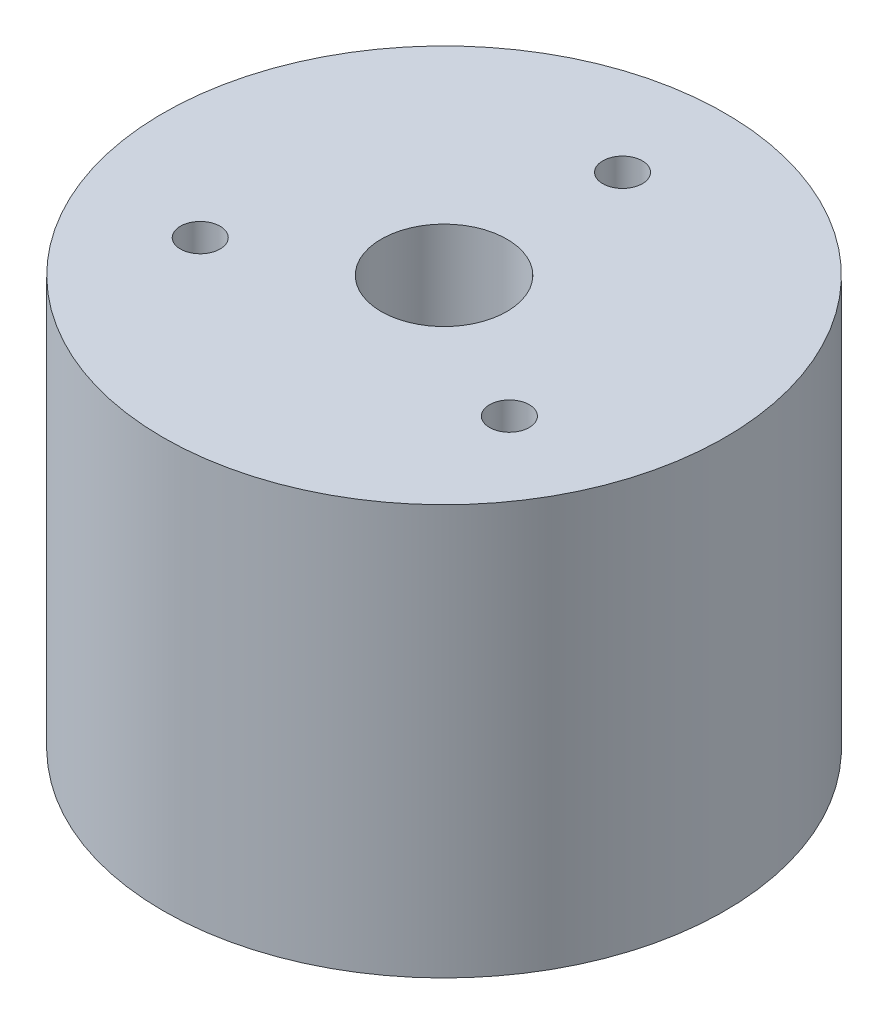
ISO-10303-21;
HEADER;
FILE_DESCRIPTION(('STEP AP214'),'2;1');
FILE_NAME('part.step','',(''),(''),'','','');
FILE_SCHEMA(('AUTOMOTIVE_DESIGN { 1 0 10303 214 1 1 1 1 }'));
ENDSEC;
DATA;
#1=APPLICATION_CONTEXT('core data for automotive mechanical design processes');
#2=APPLICATION_PROTOCOL_DEFINITION('international standard','automotive_design',2000,#1);
#3=PRODUCT_CONTEXT('',#1,'mechanical');
#4=PRODUCT('Part','Part','',(#3));
#5=PRODUCT_RELATED_PRODUCT_CATEGORY('part','',(#4));
#6=PRODUCT_DEFINITION_FORMATION('','',#4);
#7=PRODUCT_DEFINITION_CONTEXT('part definition',#1,'design');
#8=PRODUCT_DEFINITION('design','',#6,#7);
#9=PRODUCT_DEFINITION_SHAPE('','',#8);
#10=(LENGTH_UNIT() NAMED_UNIT(*) SI_UNIT(.MILLI.,.METRE.));
#11=(NAMED_UNIT(*) PLANE_ANGLE_UNIT() SI_UNIT($,.RADIAN.));
#12=(NAMED_UNIT(*) SI_UNIT($,.STERADIAN.) SOLID_ANGLE_UNIT());
#13=UNCERTAINTY_MEASURE_WITH_UNIT(LENGTH_MEASURE(1.E-05),#10,'distance_accuracy_value','');
#14=(GEOMETRIC_REPRESENTATION_CONTEXT(3) GLOBAL_UNCERTAINTY_ASSIGNED_CONTEXT((#13)) GLOBAL_UNIT_ASSIGNED_CONTEXT((#10,
#11,#12)) REPRESENTATION_CONTEXT('',''));
#15=CARTESIAN_POINT('',(0.,0.,0.));
#16=DIRECTION('',(0.,0.,1.));
#17=DIRECTION('',(1.,0.,0.));
#18=AXIS2_PLACEMENT_3D('',#15,#16,#17);
#19=CARTESIAN_POINT('',(0.,31.,0.));
#20=DIRECTION('',(0.,-1.,0.));
#21=DIRECTION('',(0.,0.,-1.));
#22=AXIS2_PLACEMENT_3D('',#19,#20,#21);
#23=CYLINDRICAL_SURFACE('',#22,21.25);
#24=CARTESIAN_POINT('',(0.,31.,0.));
#25=DIRECTION('',(0.,1.,0.));
#26=DIRECTION('',(0.,0.,1.));
#27=AXIS2_PLACEMENT_3D('',#24,#25,#26);
#28=CIRCLE('',#27,21.25);
#29=CARTESIAN_POINT('',(0.,31.,21.25));
#30=VERTEX_POINT('',#29);
#31=EDGE_CURVE('E11',#30,#30,#28,.T.);
#32=ORIENTED_EDGE('',*,*,#31,.F.);
#33=EDGE_LOOP('',(#32));
#34=FACE_BOUND('',#33,.T.);
#35=CARTESIAN_POINT('',(0.,0.,0.));
#36=DIRECTION('',(0.,1.,0.));
#37=DIRECTION('',(0.,0.,1.));
#38=AXIS2_PLACEMENT_3D('',#35,#36,#37);
#39=CIRCLE('',#38,21.25);
#40=CARTESIAN_POINT('',(0.,0.,21.25));
#41=VERTEX_POINT('',#40);
#42=EDGE_CURVE('E59',#41,#41,#39,.T.);
#43=ORIENTED_EDGE('',*,*,#42,.T.);
#44=EDGE_LOOP('',(#43));
#45=FACE_BOUND('',#44,.T.);
#46=ADVANCED_FACE('F55',(#34,#45),#23,.T.);
#47=CARTESIAN_POINT('',(0.,31.,0.));
#48=DIRECTION('',(0.,-1.,0.));
#49=DIRECTION('',(0.,0.,-1.));
#50=AXIS2_PLACEMENT_3D('',#47,#48,#49);
#51=CYLINDRICAL_SURFACE('',#50,4.75);
#52=CARTESIAN_POINT('',(0.,31.,0.));
#53=DIRECTION('',(0.,1.,0.));
#54=DIRECTION('',(0.,0.,1.));
#55=AXIS2_PLACEMENT_3D('',#52,#53,#54);
#56=CIRCLE('',#55,4.75);
#57=CARTESIAN_POINT('',(0.,31.,4.75));
#58=VERTEX_POINT('',#57);
#59=EDGE_CURVE('E63',#58,#58,#56,.T.);
#60=ORIENTED_EDGE('',*,*,#59,.T.);
#61=EDGE_LOOP('',(#60));
#62=FACE_BOUND('',#61,.T.);
#63=CARTESIAN_POINT('',(0.,0.,0.));
#64=DIRECTION('',(0.,1.,0.));
#65=DIRECTION('',(0.,0.,1.));
#66=AXIS2_PLACEMENT_3D('',#63,#64,#65);
#67=CIRCLE('',#66,4.75);
#68=CARTESIAN_POINT('',(0.,0.,4.75));
#69=VERTEX_POINT('',#68);
#70=EDGE_CURVE('E81',#69,#69,#67,.T.);
#71=ORIENTED_EDGE('',*,*,#70,.F.);
#72=EDGE_LOOP('',(#71));
#73=FACE_BOUND('',#72,.T.);
#74=ADVANCED_FACE('F114',(#62,#73),#51,.F.);
#75=CARTESIAN_POINT('',(0.,31.,-13.5));
#76=DIRECTION('',(0.,-1.,0.));
#77=DIRECTION('',(0.,0.,-1.));
#78=AXIS2_PLACEMENT_3D('',#75,#76,#77);
#79=CYLINDRICAL_SURFACE('',#78,1.5);
#80=CARTESIAN_POINT('',(0.,31.,-13.5));
#81=DIRECTION('',(0.,1.,0.));
#82=DIRECTION('',(0.,0.,1.));
#83=AXIS2_PLACEMENT_3D('',#80,#81,#82);
#84=CIRCLE('',#83,1.5);
#85=CARTESIAN_POINT('',(0.,31.,-12.));
#86=VERTEX_POINT('',#85);
#87=EDGE_CURVE('E68',#86,#86,#84,.T.);
#88=ORIENTED_EDGE('',*,*,#87,.T.);
#89=EDGE_LOOP('',(#88));
#90=FACE_BOUND('',#89,.T.);
#91=CARTESIAN_POINT('',(0.,0.,-13.5));
#92=DIRECTION('',(0.,1.,0.));
#93=DIRECTION('',(0.,0.,1.));
#94=AXIS2_PLACEMENT_3D('',#91,#92,#93);
#95=CIRCLE('',#94,1.5);
#96=CARTESIAN_POINT('',(0.,0.,-12.));
#97=VERTEX_POINT('',#96);
#98=EDGE_CURVE('E79',#97,#97,#95,.T.);
#99=ORIENTED_EDGE('',*,*,#98,.F.);
#100=EDGE_LOOP('',(#99));
#101=FACE_BOUND('',#100,.T.);
#102=ADVANCED_FACE('F102',(#90,#101),#79,.F.);
#103=CARTESIAN_POINT('',(11.6913429510904,31.,6.75000000000071));
#104=DIRECTION('',(0.,-1.,0.));
#105=DIRECTION('',(0.,0.,-1.));
#106=AXIS2_PLACEMENT_3D('',#103,#104,#105);
#107=CYLINDRICAL_SURFACE('',#106,1.5);
#108=CARTESIAN_POINT('',(11.6913429510904,31.,6.75000000000071));
#109=DIRECTION('',(0.,1.,0.));
#110=DIRECTION('',(0.,0.,1.));
#111=AXIS2_PLACEMENT_3D('',#108,#109,#110);
#112=CIRCLE('',#111,1.5);
#113=CARTESIAN_POINT('',(11.6913429510904,31.,8.25000000000071));
#114=VERTEX_POINT('',#113);
#115=EDGE_CURVE('E90',#114,#114,#112,.T.);
#116=ORIENTED_EDGE('',*,*,#115,.T.);
#117=EDGE_LOOP('',(#116));
#118=FACE_BOUND('',#117,.T.);
#119=CARTESIAN_POINT('',(11.6913429510904,0.,6.75000000000071));
#120=DIRECTION('',(0.,1.,0.));
#121=DIRECTION('',(0.,0.,1.));
#122=AXIS2_PLACEMENT_3D('',#119,#120,#121);
#123=CIRCLE('',#122,1.5);
#124=CARTESIAN_POINT('',(11.6913429510904,0.,8.25000000000071));
#125=VERTEX_POINT('',#124);
#126=EDGE_CURVE('E75',#125,#125,#123,.T.);
#127=ORIENTED_EDGE('',*,*,#126,.F.);
#128=EDGE_LOOP('',(#127));
#129=FACE_BOUND('',#128,.T.);
#130=ADVANCED_FACE('F122',(#118,#129),#107,.F.);
#131=CARTESIAN_POINT('',(-11.6913429510903,31.,6.75000000000073));
#132=DIRECTION('',(0.,-1.,0.));
#133=DIRECTION('',(0.,0.,-1.));
#134=AXIS2_PLACEMENT_3D('',#131,#132,#133);
#135=CYLINDRICAL_SURFACE('',#134,1.5);
#136=CARTESIAN_POINT('',(-11.6913429510903,31.,6.75000000000073));
#137=DIRECTION('',(0.,1.,0.));
#138=DIRECTION('',(0.,0.,1.));
#139=AXIS2_PLACEMENT_3D('',#136,#137,#138);
#140=CIRCLE('',#139,1.5);
#141=CARTESIAN_POINT('',(-11.6913429510903,31.,8.25000000000073));
#142=VERTEX_POINT('',#141);
#143=EDGE_CURVE('E86',#142,#142,#140,.T.);
#144=ORIENTED_EDGE('',*,*,#143,.T.);
#145=EDGE_LOOP('',(#144));
#146=FACE_BOUND('',#145,.T.);
#147=CARTESIAN_POINT('',(-11.6913429510903,0.,6.75000000000073));
#148=DIRECTION('',(0.,1.,0.));
#149=DIRECTION('',(0.,0.,1.));
#150=AXIS2_PLACEMENT_3D('',#147,#148,#149);
#151=CIRCLE('',#150,1.5);
#152=CARTESIAN_POINT('',(-11.6913429510903,0.,8.25000000000073));
#153=VERTEX_POINT('',#152);
#154=EDGE_CURVE('E72',#153,#153,#151,.T.);
#155=ORIENTED_EDGE('',*,*,#154,.F.);
#156=EDGE_LOOP('',(#155));
#157=FACE_BOUND('',#156,.T.);
#158=ADVANCED_FACE('F57',(#146,#157),#135,.F.);
#159=CARTESIAN_POINT('',(0.,0.,0.));
#160=DIRECTION('',(0.,1.,0.));
#161=DIRECTION('',(0.,0.,1.));
#162=AXIS2_PLACEMENT_3D('',#159,#160,#161);
#163=PLANE('',#162);
#164=CARTESIAN_POINT('',(-10.5222086559809,0.,-6.07499999999902));
#165=DIRECTION('',(0.,1.,0.));
#166=DIRECTION('',(0.,0.,1.));
#167=AXIS2_PLACEMENT_3D('',#164,#165,#166);
#168=CIRCLE('',#167,1.5);
#169=CARTESIAN_POINT('',(-10.5222086559809,0.,-4.57499999999902));
#170=VERTEX_POINT('',#169);
#171=EDGE_CURVE('E175',#170,#170,#168,.T.);
#172=ORIENTED_EDGE('',*,*,#171,.T.);
#173=EDGE_LOOP('',(#172));
#174=FACE_BOUND('',#173,.T.);
#175=CARTESIAN_POINT('',(8.50315972712074E-13,0.,12.1500000000005));
#176=DIRECTION('',(0.,1.,0.));
#177=DIRECTION('',(0.,0.,1.));
#178=AXIS2_PLACEMENT_3D('',#175,#176,#177);
#179=CIRCLE('',#178,1.5);
#180=CARTESIAN_POINT('',(8.50315972712074E-13,0.,13.6500000000005));
#181=VERTEX_POINT('',#180);
#182=EDGE_CURVE('E178',#181,#181,#179,.T.);
#183=ORIENTED_EDGE('',*,*,#182,.T.);
#184=EDGE_LOOP('',(#183));
#185=FACE_BOUND('',#184,.T.);
#186=CARTESIAN_POINT('',(10.5222086559809,0.,-6.075));
#187=DIRECTION('',(0.,1.,0.));
#188=DIRECTION('',(0.,0.,1.));
#189=AXIS2_PLACEMENT_3D('',#186,#187,#188);
#190=CIRCLE('',#189,1.5);
#191=CARTESIAN_POINT('',(10.5222086559809,0.,-4.575));
#192=VERTEX_POINT('',#191);
#193=EDGE_CURVE('E97',#192,#192,#190,.T.);
#194=ORIENTED_EDGE('',*,*,#193,.T.);
#195=EDGE_LOOP('',(#194));
#196=FACE_BOUND('',#195,.T.);
#197=ORIENTED_EDGE('',*,*,#154,.T.);
#198=EDGE_LOOP('',(#197));
#199=FACE_BOUND('',#198,.T.);
#200=ORIENTED_EDGE('',*,*,#126,.T.);
#201=EDGE_LOOP('',(#200));
#202=FACE_BOUND('',#201,.T.);
#203=ORIENTED_EDGE('',*,*,#98,.T.);
#204=EDGE_LOOP('',(#203));
#205=FACE_BOUND('',#204,.T.);
#206=ORIENTED_EDGE('',*,*,#70,.T.);
#207=EDGE_LOOP('',(#206));
#208=FACE_BOUND('',#207,.T.);
#209=ORIENTED_EDGE('',*,*,#42,.F.);
#210=EDGE_LOOP('',(#209));
#211=FACE_BOUND('',#210,.T.);
#212=ADVANCED_FACE('F109',(#174,#185,#196,#199,#202,#205,#208,#211),#163,.F.);
#213=CARTESIAN_POINT('',(0.,31.,0.));
#214=DIRECTION('',(0.,1.,0.));
#215=DIRECTION('',(0.,0.,1.));
#216=AXIS2_PLACEMENT_3D('',#213,#214,#215);
#217=PLANE('',#216);
#218=ORIENTED_EDGE('',*,*,#143,.F.);
#219=EDGE_LOOP('',(#218));
#220=FACE_BOUND('',#219,.T.);
#221=ORIENTED_EDGE('',*,*,#115,.F.);
#222=EDGE_LOOP('',(#221));
#223=FACE_BOUND('',#222,.T.);
#224=ORIENTED_EDGE('',*,*,#87,.F.);
#225=EDGE_LOOP('',(#224));
#226=FACE_BOUND('',#225,.T.);
#227=ORIENTED_EDGE('',*,*,#59,.F.);
#228=EDGE_LOOP('',(#227));
#229=FACE_BOUND('',#228,.T.);
#230=ORIENTED_EDGE('',*,*,#31,.T.);
#231=EDGE_LOOP('',(#230));
#232=FACE_BOUND('',#231,.T.);
#233=ADVANCED_FACE('F105',(#220,#223,#226,#229,#232),#217,.T.);
#234=CARTESIAN_POINT('',(10.5222086559809,5.,-6.075));
#235=DIRECTION('',(0.,-1.,0.));
#236=DIRECTION('',(0.,0.,-1.));
#237=AXIS2_PLACEMENT_3D('',#234,#235,#236);
#238=CYLINDRICAL_SURFACE('',#237,1.5);
#239=CARTESIAN_POINT('',(10.5222086559809,5.,-6.075));
#240=DIRECTION('',(0.,1.,0.));
#241=DIRECTION('',(0.,0.,1.));
#242=AXIS2_PLACEMENT_3D('',#239,#240,#241);
#243=CIRCLE('',#242,1.5);
#244=CARTESIAN_POINT('',(10.5222086559809,5.,-4.575));
#245=VERTEX_POINT('',#244);
#246=EDGE_CURVE('E76',#245,#245,#243,.T.);
#247=ORIENTED_EDGE('',*,*,#246,.T.);
#248=EDGE_LOOP('',(#247));
#249=FACE_BOUND('',#248,.T.);
#250=ORIENTED_EDGE('',*,*,#193,.F.);
#251=EDGE_LOOP('',(#250));
#252=FACE_BOUND('',#251,.T.);
#253=ADVANCED_FACE('F108',(#249,#252),#238,.F.);
#254=CARTESIAN_POINT('',(10.5222086559809,5.,-6.075));
#255=DIRECTION('',(0.,1.,0.));
#256=DIRECTION('',(0.,0.,1.));
#257=AXIS2_PLACEMENT_3D('',#254,#255,#256);
#258=PLANE('',#257);
#259=ORIENTED_EDGE('',*,*,#246,.F.);
#260=EDGE_LOOP('',(#259));
#261=FACE_BOUND('',#260,.T.);
#262=ADVANCED_FACE('F148',(#261),#258,.F.);
#263=CARTESIAN_POINT('',(8.50315972712074E-13,5.,12.1500000000005));
#264=DIRECTION('',(0.,-1.,0.));
#265=DIRECTION('',(0.,0.,-1.));
#266=AXIS2_PLACEMENT_3D('',#263,#264,#265);
#267=CYLINDRICAL_SURFACE('',#266,1.5);
#268=CARTESIAN_POINT('',(8.50315972712074E-13,5.,12.1500000000005));
#269=DIRECTION('',(0.,1.,0.));
#270=DIRECTION('',(0.,0.,1.));
#271=AXIS2_PLACEMENT_3D('',#268,#269,#270);
#272=CIRCLE('',#271,1.5);
#273=CARTESIAN_POINT('',(8.50315972712074E-13,5.,13.6500000000005));
#274=VERTEX_POINT('',#273);
#275=EDGE_CURVE('E183',#274,#274,#272,.T.);
#276=ORIENTED_EDGE('',*,*,#275,.T.);
#277=EDGE_LOOP('',(#276));
#278=FACE_BOUND('',#277,.T.);
#279=ORIENTED_EDGE('',*,*,#182,.F.);
#280=EDGE_LOOP('',(#279));
#281=FACE_BOUND('',#280,.T.);
#282=ADVANCED_FACE('F152',(#278,#281),#267,.F.);
#283=CARTESIAN_POINT('',(8.50315972712074E-13,5.,12.1500000000005));
#284=DIRECTION('',(0.,1.,0.));
#285=DIRECTION('',(0.,0.,1.));
#286=AXIS2_PLACEMENT_3D('',#283,#284,#285);
#287=PLANE('',#286);
#288=ORIENTED_EDGE('',*,*,#275,.F.);
#289=EDGE_LOOP('',(#288));
#290=FACE_BOUND('',#289,.T.);
#291=ADVANCED_FACE('F154',(#290),#287,.F.);
#292=CARTESIAN_POINT('',(-10.5222086559809,5.,-6.07499999999902));
#293=DIRECTION('',(0.,-1.,0.));
#294=DIRECTION('',(0.,0.,-1.));
#295=AXIS2_PLACEMENT_3D('',#292,#293,#294);
#296=CYLINDRICAL_SURFACE('',#295,1.5);
#297=CARTESIAN_POINT('',(-10.5222086559809,5.,-6.07499999999902));
#298=DIRECTION('',(0.,1.,0.));
#299=DIRECTION('',(0.,0.,1.));
#300=AXIS2_PLACEMENT_3D('',#297,#298,#299);
#301=CIRCLE('',#300,1.5);
#302=CARTESIAN_POINT('',(-10.5222086559809,5.,-4.57499999999902));
#303=VERTEX_POINT('',#302);
#304=EDGE_CURVE('E173',#303,#303,#301,.T.);
#305=ORIENTED_EDGE('',*,*,#304,.T.);
#306=EDGE_LOOP('',(#305));
#307=FACE_BOUND('',#306,.T.);
#308=ORIENTED_EDGE('',*,*,#171,.F.);
#309=EDGE_LOOP('',(#308));
#310=FACE_BOUND('',#309,.T.);
#311=ADVANCED_FACE('F157',(#307,#310),#296,.F.);
#312=CARTESIAN_POINT('',(-10.5222086559809,5.,-6.07499999999902));
#313=DIRECTION('',(0.,1.,0.));
#314=DIRECTION('',(0.,0.,1.));
#315=AXIS2_PLACEMENT_3D('',#312,#313,#314);
#316=PLANE('',#315);
#317=ORIENTED_EDGE('',*,*,#304,.F.);
#318=EDGE_LOOP('',(#317));
#319=FACE_BOUND('',#318,.T.);
#320=ADVANCED_FACE('F162',(#319),#316,.F.);
#321=CLOSED_SHELL('',(#46,#74,#102,#130,#158,#212,#233,#253,#262,#282,#291,#311,#320));
#322=MANIFOLD_SOLID_BREP('B2',#321);
#323=ADVANCED_BREP_SHAPE_REPRESENTATION('',(#18,#322),#14);
#324=SHAPE_DEFINITION_REPRESENTATION(#9,#323);
ENDSEC;
END-ISO-10303-21;
